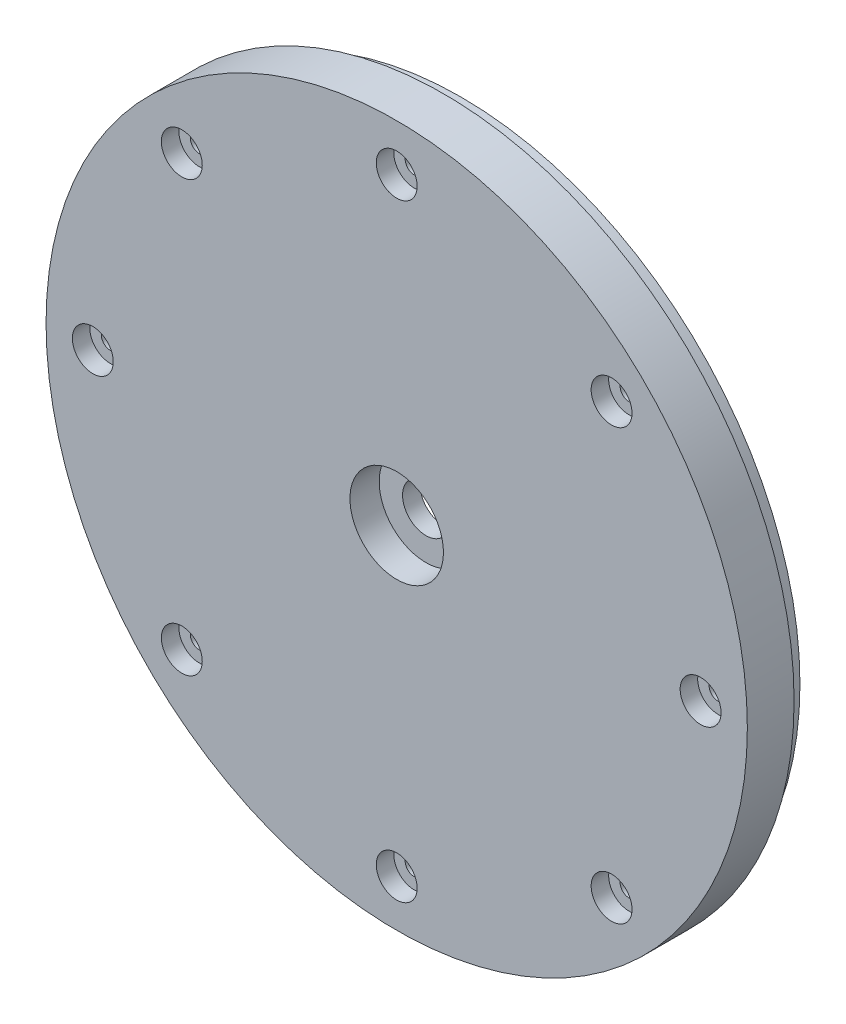
ISO-10303-21;
HEADER;
FILE_DESCRIPTION(('STEP AP214'),'2;1');
FILE_NAME('part.step','',(''),(''),'','','');
FILE_SCHEMA(('AUTOMOTIVE_DESIGN { 1 0 10303 214 1 1 1 1 }'));
ENDSEC;
DATA;
#1=APPLICATION_CONTEXT('core data for automotive mechanical design processes');
#2=APPLICATION_PROTOCOL_DEFINITION('international standard','automotive_design',2000,#1);
#3=PRODUCT_CONTEXT('',#1,'mechanical');
#4=PRODUCT('Part','Part','',(#3));
#5=PRODUCT_RELATED_PRODUCT_CATEGORY('part','',(#4));
#6=PRODUCT_DEFINITION_FORMATION('','',#4);
#7=PRODUCT_DEFINITION_CONTEXT('part definition',#1,'design');
#8=PRODUCT_DEFINITION('design','',#6,#7);
#9=PRODUCT_DEFINITION_SHAPE('','',#8);
#10=(LENGTH_UNIT() NAMED_UNIT(*) SI_UNIT(.MILLI.,.METRE.));
#11=(NAMED_UNIT(*) PLANE_ANGLE_UNIT() SI_UNIT($,.RADIAN.));
#12=(NAMED_UNIT(*) SI_UNIT($,.STERADIAN.) SOLID_ANGLE_UNIT());
#13=UNCERTAINTY_MEASURE_WITH_UNIT(LENGTH_MEASURE(1.E-05),#10,'distance_accuracy_value','');
#14=(GEOMETRIC_REPRESENTATION_CONTEXT(3) GLOBAL_UNCERTAINTY_ASSIGNED_CONTEXT((#13)) GLOBAL_UNIT_ASSIGNED_CONTEXT((#10,
#11,#12)) REPRESENTATION_CONTEXT('',''));
#15=CARTESIAN_POINT('',(0.,0.,0.));
#16=DIRECTION('',(0.,0.,1.));
#17=DIRECTION('',(1.,0.,0.));
#18=AXIS2_PLACEMENT_3D('',#15,#16,#17);
#19=CARTESIAN_POINT('',(0.,0.,0.));
#20=DIRECTION('',(0.,0.,1.));
#21=DIRECTION('',(1.,0.,0.));
#22=AXIS2_PLACEMENT_3D('',#19,#20,#21);
#23=PLANE('',#22);
#24=CARTESIAN_POINT('',(-51.9999999999984,-6.60569179452747E-13,0.));
#25=DIRECTION('',(0.,0.,1.));
#26=DIRECTION('',(1.,0.,0.));
#27=AXIS2_PLACEMENT_3D('',#24,#25,#26);
#28=CIRCLE('',#27,1.55000000000041);
#29=CARTESIAN_POINT('',(-50.449999999998,-6.60569179452747E-13,0.));
#30=VERTEX_POINT('',#29);
#31=EDGE_CURVE('E65',#30,#30,#28,.T.);
#32=ORIENTED_EDGE('',*,*,#31,.T.);
#33=EDGE_LOOP('',(#32));
#34=FACE_BOUND('',#33,.T.);
#35=CARTESIAN_POINT('',(-36.7695526216973,-36.7695526217005,0.));
#36=DIRECTION('',(0.,0.,1.));
#37=DIRECTION('',(1.,0.,0.));
#38=AXIS2_PLACEMENT_3D('',#35,#36,#37);
#39=CIRCLE('',#38,1.55000000000141);
#40=CARTESIAN_POINT('',(-35.2195526216959,-36.7695526217005,0.));
#41=VERTEX_POINT('',#40);
#42=EDGE_CURVE('E114',#41,#41,#39,.T.);
#43=ORIENTED_EDGE('',*,*,#42,.T.);
#44=EDGE_LOOP('',(#43));
#45=FACE_BOUND('',#44,.T.);
#46=CARTESIAN_POINT('',(3.77613254230709E-12,-51.9999999999984,0.));
#47=DIRECTION('',(0.,0.,1.));
#48=DIRECTION('',(1.,0.,0.));
#49=AXIS2_PLACEMENT_3D('',#46,#47,#48);
#50=CIRCLE('',#49,1.55000000000302);
#51=CARTESIAN_POINT('',(1.55000000000679,-51.9999999999984,0.));
#52=VERTEX_POINT('',#51);
#53=EDGE_CURVE('E118',#52,#52,#50,.T.);
#54=ORIENTED_EDGE('',*,*,#53,.T.);
#55=EDGE_LOOP('',(#54));
#56=FACE_BOUND('',#55,.T.);
#57=CARTESIAN_POINT('',(36.7695526217036,-36.7695526216973,0.));
#58=DIRECTION('',(0.,0.,1.));
#59=DIRECTION('',(1.,0.,0.));
#60=AXIS2_PLACEMENT_3D('',#57,#58,#59);
#61=CIRCLE('',#60,1.55000000000425);
#62=CARTESIAN_POINT('',(38.3195526217078,-36.7695526216973,0.));
#63=VERTEX_POINT('',#62);
#64=EDGE_CURVE('E122',#63,#63,#61,.T.);
#65=ORIENTED_EDGE('',*,*,#64,.T.);
#66=EDGE_LOOP('',(#65));
#67=FACE_BOUND('',#66,.T.);
#68=CARTESIAN_POINT('',(52.0000000000015,3.77266309535514E-12,0.));
#69=DIRECTION('',(0.,0.,1.));
#70=DIRECTION('',(1.,0.,0.));
#71=AXIS2_PLACEMENT_3D('',#68,#69,#70);
#72=CIRCLE('',#71,1.55000000000431);
#73=CARTESIAN_POINT('',(53.5500000000059,3.77266309535514E-12,0.));
#74=VERTEX_POINT('',#73);
#75=EDGE_CURVE('E126',#74,#74,#72,.T.);
#76=ORIENTED_EDGE('',*,*,#75,.T.);
#77=EDGE_LOOP('',(#76));
#78=FACE_BOUND('',#77,.T.);
#79=CARTESIAN_POINT('',(36.7695526217005,36.7695526217036,0.));
#80=DIRECTION('',(0.,0.,1.));
#81=DIRECTION('',(1.,0.,0.));
#82=AXIS2_PLACEMENT_3D('',#79,#80,#81);
#83=CIRCLE('',#82,1.55000000000315);
#84=CARTESIAN_POINT('',(38.3195526217036,36.7695526217036,0.));
#85=VERTEX_POINT('',#84);
#86=EDGE_CURVE('E130',#85,#85,#83,.T.);
#87=ORIENTED_EDGE('',*,*,#86,.T.);
#88=EDGE_LOOP('',(#87));
#89=FACE_BOUND('',#88,.T.);
#90=CARTESIAN_POINT('',(-6.51016934419397E-13,52.0000000000015,0.));
#91=DIRECTION('',(0.,0.,1.));
#92=DIRECTION('',(1.,0.,0.));
#93=AXIS2_PLACEMENT_3D('',#90,#91,#92);
#94=CIRCLE('',#93,1.55000000000139);
#95=CARTESIAN_POINT('',(1.55000000000074,52.0000000000015,0.));
#96=VERTEX_POINT('',#95);
#97=EDGE_CURVE('E134',#96,#96,#94,.T.);
#98=ORIENTED_EDGE('',*,*,#97,.T.);
#99=EDGE_LOOP('',(#98));
#100=FACE_BOUND('',#99,.T.);
#101=CARTESIAN_POINT('',(-36.7695526217005,36.7695526217005,0.));
#102=DIRECTION('',(0.,0.,1.));
#103=DIRECTION('',(1.,0.,0.));
#104=AXIS2_PLACEMENT_3D('',#101,#102,#103);
#105=CIRCLE('',#104,1.55);
#106=CARTESIAN_POINT('',(-35.2195526217005,36.7695526217005,0.));
#107=VERTEX_POINT('',#106);
#108=EDGE_CURVE('E137',#107,#107,#105,.T.);
#109=ORIENTED_EDGE('',*,*,#108,.T.);
#110=EDGE_LOOP('',(#109));
#111=FACE_BOUND('',#110,.T.);
#112=CARTESIAN_POINT('',(0.,0.,0.));
#113=DIRECTION('',(0.,0.,1.));
#114=DIRECTION('',(1.,0.,0.));
#115=AXIS2_PLACEMENT_3D('',#112,#113,#114);
#116=CIRCLE('',#115,4.);
#117=CARTESIAN_POINT('',(4.,0.,0.));
#118=VERTEX_POINT('',#117);
#119=EDGE_CURVE('E56',#118,#118,#116,.T.);
#120=ORIENTED_EDGE('',*,*,#119,.T.);
#121=EDGE_LOOP('',(#120));
#122=FACE_BOUND('',#121,.T.);
#123=CARTESIAN_POINT('',(0.,0.,0.));
#124=DIRECTION('',(0.,0.,-1.));
#125=DIRECTION('',(-1.,0.,0.));
#126=AXIS2_PLACEMENT_3D('',#123,#124,#125);
#127=CIRCLE('',#126,56.);
#128=CARTESIAN_POINT('',(-56.,0.,0.));
#129=VERTEX_POINT('',#128);
#130=EDGE_CURVE('E269',#129,#129,#127,.T.);
#131=ORIENTED_EDGE('',*,*,#130,.T.);
#132=EDGE_LOOP('',(#131));
#133=FACE_BOUND('',#132,.T.);
#134=ADVANCED_FACE('F37',(#34,#45,#56,#67,#78,#89,#100,#111,#122,#133),#23,.F.);
#135=CARTESIAN_POINT('',(-36.7695526217005,36.7695526217005,8.));
#136=DIRECTION('',(0.,0.,-1.));
#137=DIRECTION('',(-1.,0.,0.));
#138=AXIS2_PLACEMENT_3D('',#135,#136,#137);
#139=CYLINDRICAL_SURFACE('',#138,1.55);
#140=ORIENTED_EDGE('',*,*,#108,.F.);
#141=EDGE_LOOP('',(#140));
#142=FACE_BOUND('',#141,.T.);
#143=CARTESIAN_POINT('',(-36.7695526217005,36.7695526217005,5.));
#144=DIRECTION('',(0.,0.,1.));
#145=DIRECTION('',(1.,0.,0.));
#146=AXIS2_PLACEMENT_3D('',#143,#144,#145);
#147=CIRCLE('',#146,1.55);
#148=CARTESIAN_POINT('',(-35.2195526217005,36.7695526217005,5.));
#149=VERTEX_POINT('',#148);
#150=EDGE_CURVE('E95',#149,#149,#147,.T.);
#151=ORIENTED_EDGE('',*,*,#150,.T.);
#152=EDGE_LOOP('',(#151));
#153=FACE_BOUND('',#152,.T.);
#154=ADVANCED_FACE('F173',(#142,#153),#139,.F.);
#155=CARTESIAN_POINT('',(-6.51016934419397E-13,52.0000000000015,8.));
#156=DIRECTION('',(0.,0.,-1.));
#157=DIRECTION('',(-1.,0.,0.));
#158=AXIS2_PLACEMENT_3D('',#155,#156,#157);
#159=CYLINDRICAL_SURFACE('',#158,1.55000000000139);
#160=ORIENTED_EDGE('',*,*,#97,.F.);
#161=EDGE_LOOP('',(#160));
#162=FACE_BOUND('',#161,.T.);
#163=CARTESIAN_POINT('',(-6.51016934419397E-13,52.0000000000015,5.));
#164=DIRECTION('',(0.,0.,1.));
#165=DIRECTION('',(1.,0.,0.));
#166=AXIS2_PLACEMENT_3D('',#163,#164,#165);
#167=CIRCLE('',#166,1.55000000000139);
#168=CARTESIAN_POINT('',(1.55000000000074,52.0000000000015,5.));
#169=VERTEX_POINT('',#168);
#170=EDGE_CURVE('E92',#169,#169,#167,.T.);
#171=ORIENTED_EDGE('',*,*,#170,.T.);
#172=EDGE_LOOP('',(#171));
#173=FACE_BOUND('',#172,.T.);
#174=ADVANCED_FACE('F180',(#162,#173),#159,.F.);
#175=CARTESIAN_POINT('',(36.7695526217005,36.7695526217036,8.));
#176=DIRECTION('',(0.,0.,-1.));
#177=DIRECTION('',(-1.,0.,0.));
#178=AXIS2_PLACEMENT_3D('',#175,#176,#177);
#179=CYLINDRICAL_SURFACE('',#178,1.55000000000315);
#180=ORIENTED_EDGE('',*,*,#86,.F.);
#181=EDGE_LOOP('',(#180));
#182=FACE_BOUND('',#181,.T.);
#183=CARTESIAN_POINT('',(36.7695526217005,36.7695526217036,5.));
#184=DIRECTION('',(0.,0.,1.));
#185=DIRECTION('',(1.,0.,0.));
#186=AXIS2_PLACEMENT_3D('',#183,#184,#185);
#187=CIRCLE('',#186,1.55000000000315);
#188=CARTESIAN_POINT('',(38.3195526217036,36.7695526217036,5.));
#189=VERTEX_POINT('',#188);
#190=EDGE_CURVE('E88',#189,#189,#187,.T.);
#191=ORIENTED_EDGE('',*,*,#190,.T.);
#192=EDGE_LOOP('',(#191));
#193=FACE_BOUND('',#192,.T.);
#194=ADVANCED_FACE('F203',(#182,#193),#179,.F.);
#195=CARTESIAN_POINT('',(52.0000000000015,3.77266309535514E-12,8.));
#196=DIRECTION('',(0.,0.,-1.));
#197=DIRECTION('',(-1.,0.,0.));
#198=AXIS2_PLACEMENT_3D('',#195,#196,#197);
#199=CYLINDRICAL_SURFACE('',#198,1.55000000000431);
#200=ORIENTED_EDGE('',*,*,#75,.F.);
#201=EDGE_LOOP('',(#200));
#202=FACE_BOUND('',#201,.T.);
#203=CARTESIAN_POINT('',(52.0000000000015,3.77266309535514E-12,5.));
#204=DIRECTION('',(0.,0.,1.));
#205=DIRECTION('',(1.,0.,0.));
#206=AXIS2_PLACEMENT_3D('',#203,#204,#205);
#207=CIRCLE('',#206,1.55000000000431);
#208=CARTESIAN_POINT('',(53.5500000000059,3.77266309535514E-12,5.));
#209=VERTEX_POINT('',#208);
#210=EDGE_CURVE('E84',#209,#209,#207,.T.);
#211=ORIENTED_EDGE('',*,*,#210,.T.);
#212=EDGE_LOOP('',(#211));
#213=FACE_BOUND('',#212,.T.);
#214=ADVANCED_FACE('F207',(#202,#213),#199,.F.);
#215=CARTESIAN_POINT('',(36.7695526217036,-36.7695526216973,8.));
#216=DIRECTION('',(0.,0.,-1.));
#217=DIRECTION('',(-1.,0.,0.));
#218=AXIS2_PLACEMENT_3D('',#215,#216,#217);
#219=CYLINDRICAL_SURFACE('',#218,1.55000000000425);
#220=ORIENTED_EDGE('',*,*,#64,.F.);
#221=EDGE_LOOP('',(#220));
#222=FACE_BOUND('',#221,.T.);
#223=CARTESIAN_POINT('',(36.7695526217036,-36.7695526216973,5.));
#224=DIRECTION('',(0.,0.,1.));
#225=DIRECTION('',(1.,0.,0.));
#226=AXIS2_PLACEMENT_3D('',#223,#224,#225);
#227=CIRCLE('',#226,1.55000000000425);
#228=CARTESIAN_POINT('',(38.3195526217078,-36.7695526216973,5.));
#229=VERTEX_POINT('',#228);
#230=EDGE_CURVE('E80',#229,#229,#227,.T.);
#231=ORIENTED_EDGE('',*,*,#230,.T.);
#232=EDGE_LOOP('',(#231));
#233=FACE_BOUND('',#232,.T.);
#234=ADVANCED_FACE('F211',(#222,#233),#219,.F.);
#235=CARTESIAN_POINT('',(3.77613254230709E-12,-51.9999999999984,8.));
#236=DIRECTION('',(0.,0.,-1.));
#237=DIRECTION('',(-1.,0.,0.));
#238=AXIS2_PLACEMENT_3D('',#235,#236,#237);
#239=CYLINDRICAL_SURFACE('',#238,1.55000000000302);
#240=ORIENTED_EDGE('',*,*,#53,.F.);
#241=EDGE_LOOP('',(#240));
#242=FACE_BOUND('',#241,.T.);
#243=CARTESIAN_POINT('',(3.77613254230709E-12,-51.9999999999984,5.));
#244=DIRECTION('',(0.,0.,1.));
#245=DIRECTION('',(1.,0.,0.));
#246=AXIS2_PLACEMENT_3D('',#243,#244,#245);
#247=CIRCLE('',#246,1.55000000000302);
#248=CARTESIAN_POINT('',(1.55000000000679,-51.9999999999984,5.));
#249=VERTEX_POINT('',#248);
#250=EDGE_CURVE('E76',#249,#249,#247,.T.);
#251=ORIENTED_EDGE('',*,*,#250,.T.);
#252=EDGE_LOOP('',(#251));
#253=FACE_BOUND('',#252,.T.);
#254=ADVANCED_FACE('F215',(#242,#253),#239,.F.);
#255=CARTESIAN_POINT('',(-36.7695526216973,-36.7695526217005,8.));
#256=DIRECTION('',(0.,0.,-1.));
#257=DIRECTION('',(-1.,0.,0.));
#258=AXIS2_PLACEMENT_3D('',#255,#256,#257);
#259=CYLINDRICAL_SURFACE('',#258,1.55000000000141);
#260=ORIENTED_EDGE('',*,*,#42,.F.);
#261=EDGE_LOOP('',(#260));
#262=FACE_BOUND('',#261,.T.);
#263=CARTESIAN_POINT('',(-36.7695526216973,-36.7695526217005,5.));
#264=DIRECTION('',(0.,0.,1.));
#265=DIRECTION('',(1.,0.,0.));
#266=AXIS2_PLACEMENT_3D('',#263,#264,#265);
#267=CIRCLE('',#266,1.55000000000141);
#268=CARTESIAN_POINT('',(-35.2195526216959,-36.7695526217005,5.));
#269=VERTEX_POINT('',#268);
#270=EDGE_CURVE('E71',#269,#269,#267,.T.);
#271=ORIENTED_EDGE('',*,*,#270,.T.);
#272=EDGE_LOOP('',(#271));
#273=FACE_BOUND('',#272,.T.);
#274=ADVANCED_FACE('F219',(#262,#273),#259,.F.);
#275=CARTESIAN_POINT('',(-51.9999999999984,-6.60569179452747E-13,8.));
#276=DIRECTION('',(0.,0.,-1.));
#277=DIRECTION('',(-1.,0.,0.));
#278=AXIS2_PLACEMENT_3D('',#275,#276,#277);
#279=CYLINDRICAL_SURFACE('',#278,1.55000000000041);
#280=ORIENTED_EDGE('',*,*,#31,.F.);
#281=EDGE_LOOP('',(#280));
#282=FACE_BOUND('',#281,.T.);
#283=CARTESIAN_POINT('',(-51.9999999999984,-6.60569179452747E-13,5.));
#284=DIRECTION('',(0.,0.,1.));
#285=DIRECTION('',(1.,0.,0.));
#286=AXIS2_PLACEMENT_3D('',#283,#284,#285);
#287=CIRCLE('',#286,1.55000000000041);
#288=CARTESIAN_POINT('',(-50.449999999998,-6.60569179452747E-13,5.));
#289=VERTEX_POINT('',#288);
#290=EDGE_CURVE('E67',#289,#289,#287,.T.);
#291=ORIENTED_EDGE('',*,*,#290,.T.);
#292=EDGE_LOOP('',(#291));
#293=FACE_BOUND('',#292,.T.);
#294=ADVANCED_FACE('F152',(#282,#293),#279,.F.);
#295=CARTESIAN_POINT('',(0.,0.,8.));
#296=DIRECTION('',(0.,0.,-1.));
#297=DIRECTION('',(-1.,0.,0.));
#298=AXIS2_PLACEMENT_3D('',#295,#296,#297);
#299=CYLINDRICAL_SURFACE('',#298,4.);
#300=ORIENTED_EDGE('',*,*,#119,.F.);
#301=EDGE_LOOP('',(#300));
#302=FACE_BOUND('',#301,.T.);
#303=CARTESIAN_POINT('',(0.,0.,3.));
#304=DIRECTION('',(0.,0.,1.));
#305=DIRECTION('',(1.,0.,0.));
#306=AXIS2_PLACEMENT_3D('',#303,#304,#305);
#307=CIRCLE('',#306,4.);
#308=CARTESIAN_POINT('',(4.,0.,3.));
#309=VERTEX_POINT('',#308);
#310=EDGE_CURVE('E61',#309,#309,#307,.T.);
#311=ORIENTED_EDGE('',*,*,#310,.T.);
#312=EDGE_LOOP('',(#311));
#313=FACE_BOUND('',#312,.T.);
#314=ADVANCED_FACE('F148',(#302,#313),#299,.F.);
#315=CARTESIAN_POINT('',(0.,0.,8.));
#316=DIRECTION('',(0.,0.,1.));
#317=DIRECTION('',(1.,0.,0.));
#318=AXIS2_PLACEMENT_3D('',#315,#316,#317);
#319=PLANE('',#318);
#320=CARTESIAN_POINT('',(-6.51016934419397E-13,52.0000000000015,8.));
#321=DIRECTION('',(0.,0.,1.));
#322=DIRECTION('',(1.,0.,0.));
#323=AXIS2_PLACEMENT_3D('',#320,#321,#322);
#324=CIRCLE('',#323,3.5);
#325=CARTESIAN_POINT('',(3.49999999999935,52.0000000000015,8.));
#326=VERTEX_POINT('',#325);
#327=EDGE_CURVE('E276',#326,#326,#324,.T.);
#328=ORIENTED_EDGE('',*,*,#327,.F.);
#329=EDGE_LOOP('',(#328));
#330=FACE_BOUND('',#329,.T.);
#331=CARTESIAN_POINT('',(36.7695526217018,36.7695526217036,8.));
#332=DIRECTION('',(0.,0.,1.));
#333=DIRECTION('',(1.,0.,0.));
#334=AXIS2_PLACEMENT_3D('',#331,#332,#333);
#335=CIRCLE('',#334,3.50000000000024);
#336=CARTESIAN_POINT('',(40.269552621702,36.7695526217036,8.));
#337=VERTEX_POINT('',#336);
#338=EDGE_CURVE('E284',#337,#337,#335,.T.);
#339=ORIENTED_EDGE('',*,*,#338,.F.);
#340=EDGE_LOOP('',(#339));
#341=FACE_BOUND('',#340,.T.);
#342=CARTESIAN_POINT('',(52.0000000000038,2.85711906175772E-12,8.));
#343=DIRECTION('',(0.,0.,1.));
#344=DIRECTION('',(1.,0.,0.));
#345=AXIS2_PLACEMENT_3D('',#342,#343,#344);
#346=CIRCLE('',#345,3.50000000000164);
#347=CARTESIAN_POINT('',(55.5000000000054,2.85711906175772E-12,8.));
#348=VERTEX_POINT('',#347);
#349=EDGE_CURVE('E292',#348,#348,#346,.T.);
#350=ORIENTED_EDGE('',*,*,#349,.F.);
#351=EDGE_LOOP('',(#350));
#352=FACE_BOUND('',#351,.T.);
#353=CARTESIAN_POINT('',(36.7695526217058,-36.7695526216996,8.));
#354=DIRECTION('',(0.,0.,1.));
#355=DIRECTION('',(1.,0.,0.));
#356=AXIS2_PLACEMENT_3D('',#353,#354,#355);
#357=CIRCLE('',#356,3.50000000000341);
#358=CARTESIAN_POINT('',(40.2695526217092,-36.7695526216996,8.));
#359=VERTEX_POINT('',#358);
#360=EDGE_CURVE('E300',#359,#359,#357,.T.);
#361=ORIENTED_EDGE('',*,*,#360,.F.);
#362=EDGE_LOOP('',(#361));
#363=FACE_BOUND('',#362,.T.);
#364=CARTESIAN_POINT('',(5.06322118909605E-12,-52.0000000000015,8.));
#365=DIRECTION('',(0.,0.,1.));
#366=DIRECTION('',(1.,0.,0.));
#367=AXIS2_PLACEMENT_3D('',#364,#365,#366);
#368=CIRCLE('',#367,3.50000000000457);
#369=CARTESIAN_POINT('',(3.50000000000963,-52.0000000000015,8.));
#370=VERTEX_POINT('',#369);
#371=EDGE_CURVE('E308',#370,#370,#368,.T.);
#372=ORIENTED_EDGE('',*,*,#371,.F.);
#373=EDGE_LOOP('',(#372));
#374=FACE_BOUND('',#373,.T.);
#375=CARTESIAN_POINT('',(-36.7695526216973,-36.7695526217036,8.));
#376=DIRECTION('',(0.,0.,1.));
#377=DIRECTION('',(1.,0.,0.));
#378=AXIS2_PLACEMENT_3D('',#375,#376,#377);
#379=CIRCLE('',#378,3.50000000000449);
#380=CARTESIAN_POINT('',(-33.2695526216929,-36.7695526217036,8.));
#381=VERTEX_POINT('',#380);
#382=EDGE_CURVE('E240',#381,#381,#379,.T.);
#383=ORIENTED_EDGE('',*,*,#382,.F.);
#384=EDGE_LOOP('',(#383));
#385=FACE_BOUND('',#384,.T.);
#386=CARTESIAN_POINT('',(-51.9999999999994,-2.86348722511329E-12,8.));
#387=DIRECTION('',(0.,0.,1.));
#388=DIRECTION('',(1.,0.,0.));
#389=AXIS2_PLACEMENT_3D('',#386,#387,#388);
#390=CIRCLE('',#389,3.50000000000329);
#391=CARTESIAN_POINT('',(-48.4999999999961,-2.86348722511329E-12,8.));
#392=VERTEX_POINT('',#391);
#393=EDGE_CURVE('E241',#392,#392,#390,.T.);
#394=ORIENTED_EDGE('',*,*,#393,.F.);
#395=EDGE_LOOP('',(#394));
#396=FACE_BOUND('',#395,.T.);
#397=CARTESIAN_POINT('',(-36.7695526217014,36.7695526216996,8.));
#398=DIRECTION('',(0.,0.,1.));
#399=DIRECTION('',(1.,0.,0.));
#400=AXIS2_PLACEMENT_3D('',#397,#398,#399);
#401=CIRCLE('',#400,3.50000000000168);
#402=CARTESIAN_POINT('',(-33.2695526216997,36.7695526216996,8.));
#403=VERTEX_POINT('',#402);
#404=EDGE_CURVE('E255',#403,#403,#401,.T.);
#405=ORIENTED_EDGE('',*,*,#404,.F.);
#406=EDGE_LOOP('',(#405));
#407=FACE_BOUND('',#406,.T.);
#408=CARTESIAN_POINT('',(0.,0.,8.));
#409=DIRECTION('',(0.,0.,1.));
#410=DIRECTION('',(1.,0.,0.));
#411=AXIS2_PLACEMENT_3D('',#408,#409,#410);
#412=CIRCLE('',#411,8.);
#413=CARTESIAN_POINT('',(8.,0.,8.));
#414=VERTEX_POINT('',#413);
#415=EDGE_CURVE('E98',#414,#414,#412,.T.);
#416=ORIENTED_EDGE('',*,*,#415,.F.);
#417=EDGE_LOOP('',(#416));
#418=FACE_BOUND('',#417,.T.);
#419=CARTESIAN_POINT('',(0.,0.,8.));
#420=DIRECTION('',(0.,0.,1.));
#421=DIRECTION('',(1.,0.,0.));
#422=AXIS2_PLACEMENT_3D('',#419,#420,#421);
#423=CIRCLE('',#422,60.);
#424=CARTESIAN_POINT('',(60.,0.,8.));
#425=VERTEX_POINT('',#424);
#426=EDGE_CURVE('E45',#425,#425,#423,.T.);
#427=ORIENTED_EDGE('',*,*,#426,.T.);
#428=EDGE_LOOP('',(#427));
#429=FACE_BOUND('',#428,.T.);
#430=ADVANCED_FACE('F151',(#330,#341,#352,#363,#374,#385,#396,#407,#418,#429),#319,.T.);
#431=CARTESIAN_POINT('',(0.,0.,0.));
#432=DIRECTION('',(0.,0.,1.));
#433=DIRECTION('',(1.,0.,0.));
#434=AXIS2_PLACEMENT_3D('',#431,#432,#433);
#435=CIRCLE('',#434,58.);
#436=CARTESIAN_POINT('',(58.,0.,0.));
#437=VERTEX_POINT('',#436);
#438=EDGE_CURVE('E10',#437,#437,#435,.F.);
#439=ORIENTED_EDGE('',*,*,#438,.F.);
#440=EDGE_LOOP('',(#439));
#441=FACE_BOUND('',#440,.T.);
#442=CARTESIAN_POINT('',(0.,0.,0.));
#443=DIRECTION('',(0.,0.,1.));
#444=DIRECTION('',(1.,0.,0.));
#445=AXIS2_PLACEMENT_3D('',#442,#443,#444);
#446=CIRCLE('',#445,60.);
#447=CARTESIAN_POINT('',(60.,0.,0.));
#448=VERTEX_POINT('',#447);
#449=EDGE_CURVE('E50',#448,#448,#446,.T.);
#450=ORIENTED_EDGE('',*,*,#449,.F.);
#451=EDGE_LOOP('',(#450));
#452=FACE_BOUND('',#451,.T.);
#453=ADVANCED_FACE('F169',(#441,#452),#23,.F.);
#454=CARTESIAN_POINT('',(0.,0.,8.));
#455=DIRECTION('',(0.,0.,-1.));
#456=DIRECTION('',(-1.,0.,0.));
#457=AXIS2_PLACEMENT_3D('',#454,#455,#456);
#458=CYLINDRICAL_SURFACE('',#457,60.);
#459=ORIENTED_EDGE('',*,*,#426,.F.);
#460=EDGE_LOOP('',(#459));
#461=FACE_BOUND('',#460,.T.);
#462=ORIENTED_EDGE('',*,*,#449,.T.);
#463=EDGE_LOOP('',(#462));
#464=FACE_BOUND('',#463,.T.);
#465=ADVANCED_FACE('F39',(#461,#464),#458,.T.);
#466=CARTESIAN_POINT('',(0.,0.,3.));
#467=DIRECTION('',(0.,0.,1.));
#468=DIRECTION('',(1.,0.,0.));
#469=AXIS2_PLACEMENT_3D('',#466,#467,#468);
#470=CYLINDRICAL_SURFACE('',#469,8.);
#471=CARTESIAN_POINT('',(0.,0.,3.));
#472=DIRECTION('',(0.,0.,1.));
#473=DIRECTION('',(1.,0.,0.));
#474=AXIS2_PLACEMENT_3D('',#471,#472,#473);
#475=CIRCLE('',#474,8.);
#476=CARTESIAN_POINT('',(8.,0.,3.));
#477=VERTEX_POINT('',#476);
#478=EDGE_CURVE('E66',#477,#477,#475,.T.);
#479=ORIENTED_EDGE('',*,*,#478,.F.);
#480=EDGE_LOOP('',(#479));
#481=FACE_BOUND('',#480,.T.);
#482=ORIENTED_EDGE('',*,*,#415,.T.);
#483=EDGE_LOOP('',(#482));
#484=FACE_BOUND('',#483,.T.);
#485=ADVANCED_FACE('F160',(#481,#484),#470,.F.);
#486=CARTESIAN_POINT('',(0.,0.,3.));
#487=DIRECTION('',(0.,0.,1.));
#488=DIRECTION('',(1.,0.,0.));
#489=AXIS2_PLACEMENT_3D('',#486,#487,#488);
#490=PLANE('',#489);
#491=ORIENTED_EDGE('',*,*,#310,.F.);
#492=EDGE_LOOP('',(#491));
#493=FACE_BOUND('',#492,.T.);
#494=ORIENTED_EDGE('',*,*,#478,.T.);
#495=EDGE_LOOP('',(#494));
#496=FACE_BOUND('',#495,.T.);
#497=ADVANCED_FACE('F156',(#493,#496),#490,.T.);
#498=CARTESIAN_POINT('',(-51.9999999999994,-2.86348722511329E-12,5.));
#499=DIRECTION('',(0.,0.,1.));
#500=DIRECTION('',(1.,0.,0.));
#501=AXIS2_PLACEMENT_3D('',#498,#499,#500);
#502=CYLINDRICAL_SURFACE('',#501,3.50000000000329);
#503=CARTESIAN_POINT('',(-51.9999999999994,-2.86348722511329E-12,5.));
#504=DIRECTION('',(0.,0.,1.));
#505=DIRECTION('',(1.,0.,0.));
#506=AXIS2_PLACEMENT_3D('',#503,#504,#505);
#507=CIRCLE('',#506,3.50000000000329);
#508=CARTESIAN_POINT('',(-48.4999999999961,-2.86348722511329E-12,5.));
#509=VERTEX_POINT('',#508);
#510=EDGE_CURVE('E237',#509,#509,#507,.T.);
#511=ORIENTED_EDGE('',*,*,#510,.F.);
#512=EDGE_LOOP('',(#511));
#513=FACE_BOUND('',#512,.T.);
#514=ORIENTED_EDGE('',*,*,#393,.T.);
#515=EDGE_LOOP('',(#514));
#516=FACE_BOUND('',#515,.T.);
#517=ADVANCED_FACE('F159',(#513,#516),#502,.F.);
#518=CARTESIAN_POINT('',(-51.9999999999994,-2.86348722511329E-12,5.));
#519=DIRECTION('',(0.,0.,1.));
#520=DIRECTION('',(1.,0.,0.));
#521=AXIS2_PLACEMENT_3D('',#518,#519,#520);
#522=PLANE('',#521);
#523=ORIENTED_EDGE('',*,*,#290,.F.);
#524=EDGE_LOOP('',(#523));
#525=FACE_BOUND('',#524,.T.);
#526=ORIENTED_EDGE('',*,*,#510,.T.);
#527=EDGE_LOOP('',(#526));
#528=FACE_BOUND('',#527,.T.);
#529=ADVANCED_FACE('F230',(#525,#528),#522,.T.);
#530=CARTESIAN_POINT('',(-36.7695526216973,-36.7695526217036,5.));
#531=DIRECTION('',(0.,0.,1.));
#532=DIRECTION('',(1.,0.,0.));
#533=AXIS2_PLACEMENT_3D('',#530,#531,#532);
#534=CYLINDRICAL_SURFACE('',#533,3.50000000000449);
#535=CARTESIAN_POINT('',(-36.7695526216973,-36.7695526217036,5.));
#536=DIRECTION('',(0.,0.,1.));
#537=DIRECTION('',(1.,0.,0.));
#538=AXIS2_PLACEMENT_3D('',#535,#536,#537);
#539=CIRCLE('',#538,3.50000000000449);
#540=CARTESIAN_POINT('',(-33.2695526216929,-36.7695526217036,5.));
#541=VERTEX_POINT('',#540);
#542=EDGE_CURVE('E246',#541,#541,#539,.T.);
#543=ORIENTED_EDGE('',*,*,#542,.F.);
#544=EDGE_LOOP('',(#543));
#545=FACE_BOUND('',#544,.T.);
#546=ORIENTED_EDGE('',*,*,#382,.T.);
#547=EDGE_LOOP('',(#546));
#548=FACE_BOUND('',#547,.T.);
#549=ADVANCED_FACE('F233',(#545,#548),#534,.F.);
#550=CARTESIAN_POINT('',(-36.7695526216973,-36.7695526217036,5.));
#551=DIRECTION('',(0.,0.,1.));
#552=DIRECTION('',(1.,0.,0.));
#553=AXIS2_PLACEMENT_3D('',#550,#551,#552);
#554=PLANE('',#553);
#555=ORIENTED_EDGE('',*,*,#270,.F.);
#556=EDGE_LOOP('',(#555));
#557=FACE_BOUND('',#556,.T.);
#558=ORIENTED_EDGE('',*,*,#542,.T.);
#559=EDGE_LOOP('',(#558));
#560=FACE_BOUND('',#559,.T.);
#561=ADVANCED_FACE('F315',(#557,#560),#554,.T.);
#562=CARTESIAN_POINT('',(5.06322118909605E-12,-52.0000000000015,5.));
#563=DIRECTION('',(0.,0.,1.));
#564=DIRECTION('',(1.,0.,0.));
#565=AXIS2_PLACEMENT_3D('',#562,#563,#564);
#566=CYLINDRICAL_SURFACE('',#565,3.50000000000457);
#567=CARTESIAN_POINT('',(5.06322118909605E-12,-52.0000000000015,5.));
#568=DIRECTION('',(0.,0.,1.));
#569=DIRECTION('',(1.,0.,0.));
#570=AXIS2_PLACEMENT_3D('',#567,#568,#569);
#571=CIRCLE('',#570,3.50000000000457);
#572=CARTESIAN_POINT('',(3.50000000000963,-52.0000000000015,5.));
#573=VERTEX_POINT('',#572);
#574=EDGE_CURVE('E304',#573,#573,#571,.T.);
#575=ORIENTED_EDGE('',*,*,#574,.F.);
#576=EDGE_LOOP('',(#575));
#577=FACE_BOUND('',#576,.T.);
#578=ORIENTED_EDGE('',*,*,#371,.T.);
#579=EDGE_LOOP('',(#578));
#580=FACE_BOUND('',#579,.T.);
#581=ADVANCED_FACE('F387',(#577,#580),#566,.F.);
#582=CARTESIAN_POINT('',(5.06322118909605E-12,-52.0000000000015,5.));
#583=DIRECTION('',(0.,0.,1.));
#584=DIRECTION('',(1.,0.,0.));
#585=AXIS2_PLACEMENT_3D('',#582,#583,#584);
#586=PLANE('',#585);
#587=ORIENTED_EDGE('',*,*,#250,.F.);
#588=EDGE_LOOP('',(#587));
#589=FACE_BOUND('',#588,.T.);
#590=ORIENTED_EDGE('',*,*,#574,.T.);
#591=EDGE_LOOP('',(#590));
#592=FACE_BOUND('',#591,.T.);
#593=ADVANCED_FACE('F383',(#589,#592),#586,.T.);
#594=CARTESIAN_POINT('',(36.7695526217058,-36.7695526216996,5.));
#595=DIRECTION('',(0.,0.,1.));
#596=DIRECTION('',(1.,0.,0.));
#597=AXIS2_PLACEMENT_3D('',#594,#595,#596);
#598=CYLINDRICAL_SURFACE('',#597,3.50000000000341);
#599=CARTESIAN_POINT('',(36.7695526217058,-36.7695526216996,5.));
#600=DIRECTION('',(0.,0.,1.));
#601=DIRECTION('',(1.,0.,0.));
#602=AXIS2_PLACEMENT_3D('',#599,#600,#601);
#603=CIRCLE('',#602,3.50000000000341);
#604=CARTESIAN_POINT('',(40.2695526217092,-36.7695526216996,5.));
#605=VERTEX_POINT('',#604);
#606=EDGE_CURVE('E296',#605,#605,#603,.T.);
#607=ORIENTED_EDGE('',*,*,#606,.F.);
#608=EDGE_LOOP('',(#607));
#609=FACE_BOUND('',#608,.T.);
#610=ORIENTED_EDGE('',*,*,#360,.T.);
#611=EDGE_LOOP('',(#610));
#612=FACE_BOUND('',#611,.T.);
#613=ADVANCED_FACE('F379',(#609,#612),#598,.F.);
#614=CARTESIAN_POINT('',(36.7695526217058,-36.7695526216996,5.));
#615=DIRECTION('',(0.,0.,1.));
#616=DIRECTION('',(1.,0.,0.));
#617=AXIS2_PLACEMENT_3D('',#614,#615,#616);
#618=PLANE('',#617);
#619=ORIENTED_EDGE('',*,*,#230,.F.);
#620=EDGE_LOOP('',(#619));
#621=FACE_BOUND('',#620,.T.);
#622=ORIENTED_EDGE('',*,*,#606,.T.);
#623=EDGE_LOOP('',(#622));
#624=FACE_BOUND('',#623,.T.);
#625=ADVANCED_FACE('F375',(#621,#624),#618,.T.);
#626=CARTESIAN_POINT('',(52.0000000000038,2.85711906175772E-12,5.));
#627=DIRECTION('',(0.,0.,1.));
#628=DIRECTION('',(1.,0.,0.));
#629=AXIS2_PLACEMENT_3D('',#626,#627,#628);
#630=CYLINDRICAL_SURFACE('',#629,3.50000000000164);
#631=CARTESIAN_POINT('',(52.0000000000038,2.85711906175772E-12,5.));
#632=DIRECTION('',(0.,0.,1.));
#633=DIRECTION('',(1.,0.,0.));
#634=AXIS2_PLACEMENT_3D('',#631,#632,#633);
#635=CIRCLE('',#634,3.50000000000164);
#636=CARTESIAN_POINT('',(55.5000000000054,2.85711906175772E-12,5.));
#637=VERTEX_POINT('',#636);
#638=EDGE_CURVE('E288',#637,#637,#635,.T.);
#639=ORIENTED_EDGE('',*,*,#638,.F.);
#640=EDGE_LOOP('',(#639));
#641=FACE_BOUND('',#640,.T.);
#642=ORIENTED_EDGE('',*,*,#349,.T.);
#643=EDGE_LOOP('',(#642));
#644=FACE_BOUND('',#643,.T.);
#645=ADVANCED_FACE('F371',(#641,#644),#630,.F.);
#646=CARTESIAN_POINT('',(52.0000000000038,2.85711906175772E-12,5.));
#647=DIRECTION('',(0.,0.,1.));
#648=DIRECTION('',(1.,0.,0.));
#649=AXIS2_PLACEMENT_3D('',#646,#647,#648);
#650=PLANE('',#649);
#651=ORIENTED_EDGE('',*,*,#210,.F.);
#652=EDGE_LOOP('',(#651));
#653=FACE_BOUND('',#652,.T.);
#654=ORIENTED_EDGE('',*,*,#638,.T.);
#655=EDGE_LOOP('',(#654));
#656=FACE_BOUND('',#655,.T.);
#657=ADVANCED_FACE('F367',(#653,#656),#650,.T.);
#658=CARTESIAN_POINT('',(36.7695526217018,36.7695526217036,5.));
#659=DIRECTION('',(0.,0.,1.));
#660=DIRECTION('',(1.,0.,0.));
#661=AXIS2_PLACEMENT_3D('',#658,#659,#660);
#662=CYLINDRICAL_SURFACE('',#661,3.50000000000024);
#663=CARTESIAN_POINT('',(36.7695526217018,36.7695526217036,5.));
#664=DIRECTION('',(0.,0.,1.));
#665=DIRECTION('',(1.,0.,0.));
#666=AXIS2_PLACEMENT_3D('',#663,#664,#665);
#667=CIRCLE('',#666,3.50000000000024);
#668=CARTESIAN_POINT('',(40.269552621702,36.7695526217036,5.));
#669=VERTEX_POINT('',#668);
#670=EDGE_CURVE('E280',#669,#669,#667,.T.);
#671=ORIENTED_EDGE('',*,*,#670,.F.);
#672=EDGE_LOOP('',(#671));
#673=FACE_BOUND('',#672,.T.);
#674=ORIENTED_EDGE('',*,*,#338,.T.);
#675=EDGE_LOOP('',(#674));
#676=FACE_BOUND('',#675,.T.);
#677=ADVANCED_FACE('F363',(#673,#676),#662,.F.);
#678=CARTESIAN_POINT('',(36.7695526217018,36.7695526217036,5.));
#679=DIRECTION('',(0.,0.,1.));
#680=DIRECTION('',(1.,0.,0.));
#681=AXIS2_PLACEMENT_3D('',#678,#679,#680);
#682=PLANE('',#681);
#683=ORIENTED_EDGE('',*,*,#190,.F.);
#684=EDGE_LOOP('',(#683));
#685=FACE_BOUND('',#684,.T.);
#686=ORIENTED_EDGE('',*,*,#670,.T.);
#687=EDGE_LOOP('',(#686));
#688=FACE_BOUND('',#687,.T.);
#689=ADVANCED_FACE('F352',(#685,#688),#682,.T.);
#690=CARTESIAN_POINT('',(-6.51016934419397E-13,52.0000000000015,5.));
#691=DIRECTION('',(0.,0.,1.));
#692=DIRECTION('',(1.,0.,0.));
#693=AXIS2_PLACEMENT_3D('',#690,#691,#692);
#694=CYLINDRICAL_SURFACE('',#693,3.5);
#695=CARTESIAN_POINT('',(-6.51016934419397E-13,52.0000000000015,5.));
#696=DIRECTION('',(0.,0.,1.));
#697=DIRECTION('',(1.,0.,0.));
#698=AXIS2_PLACEMENT_3D('',#695,#696,#697);
#699=CIRCLE('',#698,3.5);
#700=CARTESIAN_POINT('',(3.49999999999935,52.0000000000015,5.));
#701=VERTEX_POINT('',#700);
#702=EDGE_CURVE('E72',#701,#701,#699,.T.);
#703=ORIENTED_EDGE('',*,*,#702,.F.);
#704=EDGE_LOOP('',(#703));
#705=FACE_BOUND('',#704,.T.);
#706=ORIENTED_EDGE('',*,*,#327,.T.);
#707=EDGE_LOOP('',(#706));
#708=FACE_BOUND('',#707,.T.);
#709=ADVANCED_FACE('F344',(#705,#708),#694,.F.);
#710=CARTESIAN_POINT('',(-6.51016934419397E-13,52.0000000000015,5.));
#711=DIRECTION('',(0.,0.,1.));
#712=DIRECTION('',(1.,0.,0.));
#713=AXIS2_PLACEMENT_3D('',#710,#711,#712);
#714=PLANE('',#713);
#715=ORIENTED_EDGE('',*,*,#170,.F.);
#716=EDGE_LOOP('',(#715));
#717=FACE_BOUND('',#716,.T.);
#718=ORIENTED_EDGE('',*,*,#702,.T.);
#719=EDGE_LOOP('',(#718));
#720=FACE_BOUND('',#719,.T.);
#721=ADVANCED_FACE('F339',(#717,#720),#714,.T.);
#722=CARTESIAN_POINT('',(-36.7695526217014,36.7695526216996,5.));
#723=DIRECTION('',(0.,0.,1.));
#724=DIRECTION('',(1.,0.,0.));
#725=AXIS2_PLACEMENT_3D('',#722,#723,#724);
#726=CYLINDRICAL_SURFACE('',#725,3.50000000000168);
#727=CARTESIAN_POINT('',(-36.7695526217014,36.7695526216996,5.));
#728=DIRECTION('',(0.,0.,1.));
#729=DIRECTION('',(1.,0.,0.));
#730=AXIS2_PLACEMENT_3D('',#727,#728,#729);
#731=CIRCLE('',#730,3.50000000000168);
#732=CARTESIAN_POINT('',(-33.2695526216997,36.7695526216996,5.));
#733=VERTEX_POINT('',#732);
#734=EDGE_CURVE('E249',#733,#733,#731,.T.);
#735=ORIENTED_EDGE('',*,*,#734,.F.);
#736=EDGE_LOOP('',(#735));
#737=FACE_BOUND('',#736,.T.);
#738=ORIENTED_EDGE('',*,*,#404,.T.);
#739=EDGE_LOOP('',(#738));
#740=FACE_BOUND('',#739,.T.);
#741=ADVANCED_FACE('F336',(#737,#740),#726,.F.);
#742=CARTESIAN_POINT('',(-36.7695526217014,36.7695526216996,5.));
#743=DIRECTION('',(0.,0.,1.));
#744=DIRECTION('',(1.,0.,0.));
#745=AXIS2_PLACEMENT_3D('',#742,#743,#744);
#746=PLANE('',#745);
#747=ORIENTED_EDGE('',*,*,#150,.F.);
#748=EDGE_LOOP('',(#747));
#749=FACE_BOUND('',#748,.T.);
#750=ORIENTED_EDGE('',*,*,#734,.T.);
#751=EDGE_LOOP('',(#750));
#752=FACE_BOUND('',#751,.T.);
#753=ADVANCED_FACE('F332',(#749,#752),#746,.T.);
#754=CARTESIAN_POINT('',(0.,0.,-3.));
#755=DIRECTION('',(0.,0.,-1.));
#756=DIRECTION('',(-1.,0.,0.));
#757=AXIS2_PLACEMENT_3D('',#754,#755,#756);
#758=PLANE('',#757);
#759=CARTESIAN_POINT('',(0.,0.,-3.));
#760=DIRECTION('',(0.,0.,-1.));
#761=DIRECTION('',(-1.,0.,0.));
#762=AXIS2_PLACEMENT_3D('',#759,#760,#761);
#763=CIRCLE('',#762,58.);
#764=CARTESIAN_POINT('',(-58.,0.,-3.));
#765=VERTEX_POINT('',#764);
#766=EDGE_CURVE('E258',#765,#765,#763,.T.);
#767=ORIENTED_EDGE('',*,*,#766,.T.);
#768=EDGE_LOOP('',(#767));
#769=FACE_BOUND('',#768,.T.);
#770=CARTESIAN_POINT('',(0.,0.,-3.));
#771=DIRECTION('',(0.,0.,-1.));
#772=DIRECTION('',(-1.,0.,0.));
#773=AXIS2_PLACEMENT_3D('',#770,#771,#772);
#774=CIRCLE('',#773,56.);
#775=CARTESIAN_POINT('',(-56.,0.,-3.));
#776=VERTEX_POINT('',#775);
#777=EDGE_CURVE('E263',#776,#776,#774,.T.);
#778=ORIENTED_EDGE('',*,*,#777,.F.);
#779=EDGE_LOOP('',(#778));
#780=FACE_BOUND('',#779,.T.);
#781=ADVANCED_FACE('F335',(#769,#780),#758,.T.);
#782=CARTESIAN_POINT('',(0.,0.,-3.));
#783=DIRECTION('',(0.,0.,1.));
#784=DIRECTION('',(1.,0.,0.));
#785=AXIS2_PLACEMENT_3D('',#782,#783,#784);
#786=CYLINDRICAL_SURFACE('',#785,58.);
#787=ORIENTED_EDGE('',*,*,#766,.F.);
#788=EDGE_LOOP('',(#787));
#789=FACE_BOUND('',#788,.T.);
#790=ORIENTED_EDGE('',*,*,#438,.T.);
#791=EDGE_LOOP('',(#790));
#792=FACE_BOUND('',#791,.T.);
#793=ADVANCED_FACE('F358',(#789,#792),#786,.T.);
#794=CARTESIAN_POINT('',(0.,0.,-3.));
#795=DIRECTION('',(0.,0.,1.));
#796=DIRECTION('',(1.,0.,0.));
#797=AXIS2_PLACEMENT_3D('',#794,#795,#796);
#798=CYLINDRICAL_SURFACE('',#797,56.);
#799=ORIENTED_EDGE('',*,*,#777,.T.);
#800=EDGE_LOOP('',(#799));
#801=FACE_BOUND('',#800,.T.);
#802=ORIENTED_EDGE('',*,*,#130,.F.);
#803=EDGE_LOOP('',(#802));
#804=FACE_BOUND('',#803,.T.);
#805=ADVANCED_FACE('F465',(#801,#804),#798,.F.);
#806=CLOSED_SHELL('',(#134,#154,#174,#194,#214,#234,#254,#274,#294,#314,#430,#453,#465,#485,
#497,#517,#529,#549,#561,#581,#593,#613,#625,#645,#657,#677,#689,#709,#721,#741,#753,#781,#793,#805));
#807=MANIFOLD_SOLID_BREP('B2',#806);
#808=ADVANCED_BREP_SHAPE_REPRESENTATION('',(#18,#807),#14);
#809=SHAPE_DEFINITION_REPRESENTATION(#9,#808);
ENDSEC;
END-ISO-10303-21;
